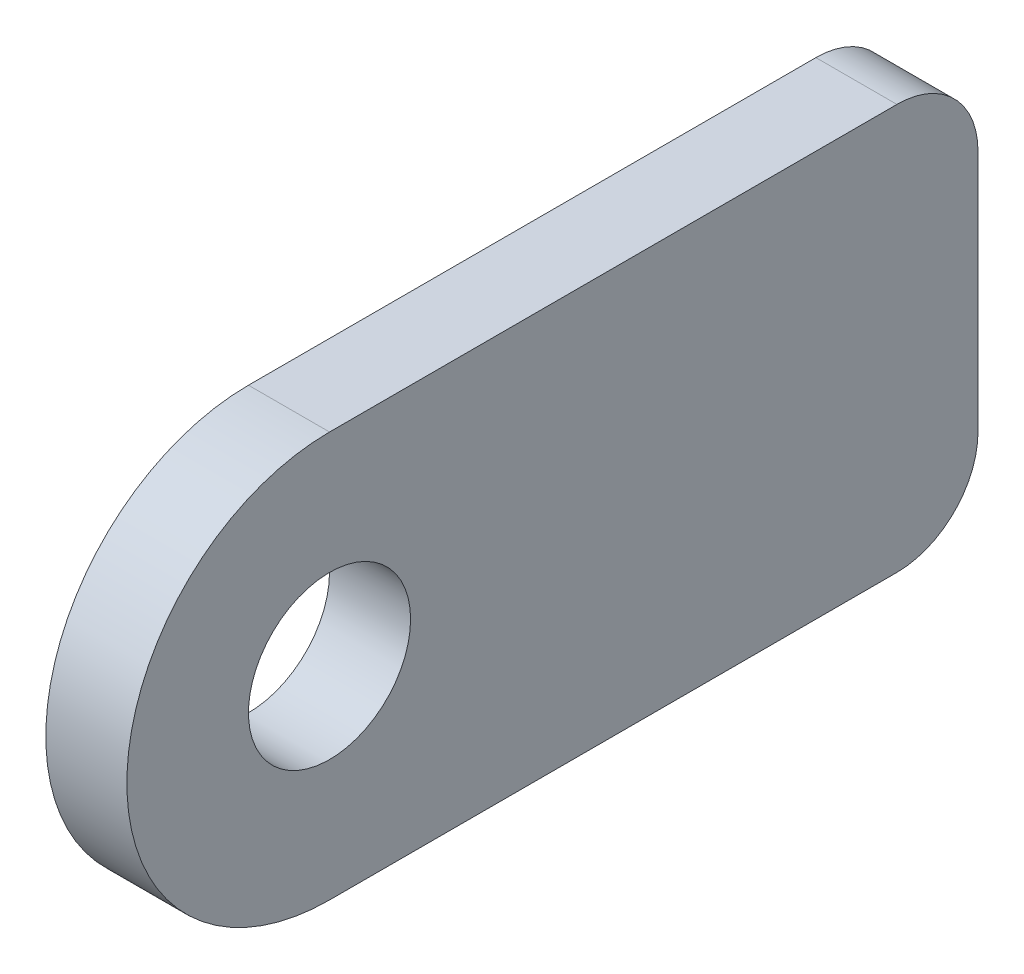
ISO-10303-21;
HEADER;
FILE_DESCRIPTION(('STEP AP214'),'2;1');
FILE_NAME('part.step','',(''),(''),'','','');
FILE_SCHEMA(('AUTOMOTIVE_DESIGN { 1 0 10303 214 1 1 1 1 }'));
ENDSEC;
DATA;
#1=APPLICATION_CONTEXT('core data for automotive mechanical design processes');
#2=APPLICATION_PROTOCOL_DEFINITION('international standard','automotive_design',2000,#1);
#3=PRODUCT_CONTEXT('',#1,'mechanical');
#4=PRODUCT('Part','Part','',(#3));
#5=PRODUCT_RELATED_PRODUCT_CATEGORY('part','',(#4));
#6=PRODUCT_DEFINITION_FORMATION('','',#4);
#7=PRODUCT_DEFINITION_CONTEXT('part definition',#1,'design');
#8=PRODUCT_DEFINITION('design','',#6,#7);
#9=PRODUCT_DEFINITION_SHAPE('','',#8);
#10=(LENGTH_UNIT() NAMED_UNIT(*) SI_UNIT(.MILLI.,.METRE.));
#11=(NAMED_UNIT(*) PLANE_ANGLE_UNIT() SI_UNIT($,.RADIAN.));
#12=(NAMED_UNIT(*) SI_UNIT($,.STERADIAN.) SOLID_ANGLE_UNIT());
#13=UNCERTAINTY_MEASURE_WITH_UNIT(LENGTH_MEASURE(1.E-05),#10,'distance_accuracy_value','');
#14=(GEOMETRIC_REPRESENTATION_CONTEXT(3) GLOBAL_UNCERTAINTY_ASSIGNED_CONTEXT((#13)) GLOBAL_UNIT_ASSIGNED_CONTEXT((#10,
#11,#12)) REPRESENTATION_CONTEXT('',''));
#15=CARTESIAN_POINT('',(0.,0.,0.));
#16=DIRECTION('',(0.,0.,1.));
#17=DIRECTION('',(1.,0.,0.));
#18=AXIS2_PLACEMENT_3D('',#15,#16,#17);
#19=CARTESIAN_POINT('',(10.,-25.,-20.));
#20=DIRECTION('',(1.,0.,0.));
#21=DIRECTION('',(0.,0.,-1.));
#22=AXIS2_PLACEMENT_3D('',#19,#20,#21);
#23=PLANE('',#22);
#24=DIRECTION('',(0.,1.,0.));
#25=VECTOR('',#24,1.);
#26=CARTESIAN_POINT('',(10.,0.,-100.));
#27=LINE('',#26,#25);
#28=CARTESIAN_POINT('',(10.,-40.,-100.));
#29=VERTEX_POINT('',#28);
#30=CARTESIAN_POINT('',(10.,-10.,-100.));
#31=VERTEX_POINT('',#30);
#32=EDGE_CURVE('E103',#29,#31,#27,.T.);
#33=ORIENTED_EDGE('',*,*,#32,.T.);
#34=CARTESIAN_POINT('',(10.,-10.,-90.));
#35=DIRECTION('',(1.,0.,0.));
#36=DIRECTION('',(0.,0.,-1.));
#37=AXIS2_PLACEMENT_3D('',#34,#35,#36);
#38=CIRCLE('',#37,10.);
#39=CARTESIAN_POINT('',(10.,0.,-90.));
#40=VERTEX_POINT('',#39);
#41=EDGE_CURVE('E50',#31,#40,#38,.T.);
#42=ORIENTED_EDGE('',*,*,#41,.T.);
#43=DIRECTION('',(0.,0.,1.));
#44=VECTOR('',#43,1.);
#45=CARTESIAN_POINT('',(10.,0.,-20.));
#46=LINE('',#45,#44);
#47=CARTESIAN_POINT('',(10.,0.,-20.));
#48=VERTEX_POINT('',#47);
#49=EDGE_CURVE('E91',#40,#48,#46,.T.);
#50=ORIENTED_EDGE('',*,*,#49,.T.);
#51=CARTESIAN_POINT('',(10.,-25.,-20.));
#52=DIRECTION('',(1.,0.,0.));
#53=DIRECTION('',(0.,0.,-1.));
#54=AXIS2_PLACEMENT_3D('',#51,#52,#53);
#55=CIRCLE('',#54,25.);
#56=CARTESIAN_POINT('',(10.,-50.,-20.));
#57=VERTEX_POINT('',#56);
#58=EDGE_CURVE('E100',#48,#57,#55,.T.);
#59=ORIENTED_EDGE('',*,*,#58,.T.);
#60=DIRECTION('',(0.,0.,-1.));
#61=VECTOR('',#60,1.);
#62=CARTESIAN_POINT('',(10.,-50.,-20.));
#63=LINE('',#62,#61);
#64=CARTESIAN_POINT('',(10.,-50.,-90.));
#65=VERTEX_POINT('',#64);
#66=EDGE_CURVE('E120',#57,#65,#63,.T.);
#67=ORIENTED_EDGE('',*,*,#66,.T.);
#68=CARTESIAN_POINT('',(10.,-40.,-90.));
#69=DIRECTION('',(1.,0.,0.));
#70=DIRECTION('',(0.,0.,-1.));
#71=AXIS2_PLACEMENT_3D('',#68,#69,#70);
#72=CIRCLE('',#71,10.);
#73=EDGE_CURVE('E138',#65,#29,#72,.T.);
#74=ORIENTED_EDGE('',*,*,#73,.T.);
#75=EDGE_LOOP('',(#33,#42,#50,#59,#67,#74));
#76=FACE_BOUND('',#75,.T.);
#77=CARTESIAN_POINT('',(10.,-25.,-20.));
#78=DIRECTION('',(1.,0.,0.));
#79=DIRECTION('',(0.,0.,-1.));
#80=AXIS2_PLACEMENT_3D('',#77,#78,#79);
#81=CIRCLE('',#80,10.);
#82=CARTESIAN_POINT('',(10.,-25.,-30.));
#83=VERTEX_POINT('',#82);
#84=EDGE_CURVE('E121',#83,#83,#81,.T.);
#85=ORIENTED_EDGE('',*,*,#84,.F.);
#86=EDGE_LOOP('',(#85));
#87=FACE_BOUND('',#86,.T.);
#88=ADVANCED_FACE('F39',(#76,#87),#23,.T.);
#89=CARTESIAN_POINT('',(0.,-25.,-20.));
#90=DIRECTION('',(1.,0.,0.));
#91=DIRECTION('',(0.,0.,-1.));
#92=AXIS2_PLACEMENT_3D('',#89,#90,#91);
#93=PLANE('',#92);
#94=DIRECTION('',(0.,0.,1.));
#95=VECTOR('',#94,1.);
#96=CARTESIAN_POINT('',(0.,0.,-20.));
#97=LINE('',#96,#95);
#98=CARTESIAN_POINT('',(0.,0.,-90.));
#99=VERTEX_POINT('',#98);
#100=CARTESIAN_POINT('',(0.,0.,-20.));
#101=VERTEX_POINT('',#100);
#102=EDGE_CURVE('E108',#99,#101,#97,.T.);
#103=ORIENTED_EDGE('',*,*,#102,.F.);
#104=CARTESIAN_POINT('',(0.,-10.,-90.));
#105=DIRECTION('',(1.,0.,0.));
#106=DIRECTION('',(0.,0.,-1.));
#107=AXIS2_PLACEMENT_3D('',#104,#105,#106);
#108=CIRCLE('',#107,10.);
#109=CARTESIAN_POINT('',(0.,-10.,-100.));
#110=VERTEX_POINT('',#109);
#111=EDGE_CURVE('E131',#99,#110,#108,.F.);
#112=ORIENTED_EDGE('',*,*,#111,.T.);
#113=DIRECTION('',(0.,1.,0.));
#114=VECTOR('',#113,1.);
#115=CARTESIAN_POINT('',(0.,0.,-100.));
#116=LINE('',#115,#114);
#117=CARTESIAN_POINT('',(0.,-40.,-100.));
#118=VERTEX_POINT('',#117);
#119=EDGE_CURVE('E124',#118,#110,#116,.T.);
#120=ORIENTED_EDGE('',*,*,#119,.F.);
#121=CARTESIAN_POINT('',(0.,-40.,-90.));
#122=DIRECTION('',(1.,0.,0.));
#123=DIRECTION('',(0.,0.,-1.));
#124=AXIS2_PLACEMENT_3D('',#121,#122,#123);
#125=CIRCLE('',#124,10.);
#126=CARTESIAN_POINT('',(0.,-50.,-90.));
#127=VERTEX_POINT('',#126);
#128=EDGE_CURVE('E135',#118,#127,#125,.F.);
#129=ORIENTED_EDGE('',*,*,#128,.T.);
#130=DIRECTION('',(0.,0.,-1.));
#131=VECTOR('',#130,1.);
#132=CARTESIAN_POINT('',(0.,-50.,-20.));
#133=LINE('',#132,#131);
#134=CARTESIAN_POINT('',(0.,-50.,-20.));
#135=VERTEX_POINT('',#134);
#136=EDGE_CURVE('E126',#135,#127,#133,.T.);
#137=ORIENTED_EDGE('',*,*,#136,.F.);
#138=CARTESIAN_POINT('',(0.,-25.,-20.));
#139=DIRECTION('',(1.,0.,0.));
#140=DIRECTION('',(0.,0.,-1.));
#141=AXIS2_PLACEMENT_3D('',#138,#139,#140);
#142=CIRCLE('',#141,25.);
#143=EDGE_CURVE('E127',#101,#135,#142,.T.);
#144=ORIENTED_EDGE('',*,*,#143,.F.);
#145=EDGE_LOOP('',(#103,#112,#120,#129,#137,#144));
#146=FACE_BOUND('',#145,.T.);
#147=CARTESIAN_POINT('',(0.,-25.,-20.));
#148=DIRECTION('',(1.,0.,0.));
#149=DIRECTION('',(0.,0.,-1.));
#150=AXIS2_PLACEMENT_3D('',#147,#148,#149);
#151=CIRCLE('',#150,10.);
#152=CARTESIAN_POINT('',(0.,-25.,-30.));
#153=VERTEX_POINT('',#152);
#154=EDGE_CURVE('E228',#153,#153,#151,.T.);
#155=ORIENTED_EDGE('',*,*,#154,.T.);
#156=EDGE_LOOP('',(#155));
#157=FACE_BOUND('',#156,.T.);
#158=ADVANCED_FACE('F146',(#146,#157),#93,.F.);
#159=CARTESIAN_POINT('',(10.,0.,-100.));
#160=DIRECTION('',(0.,0.,1.));
#161=DIRECTION('',(0.,-1.,0.));
#162=AXIS2_PLACEMENT_3D('',#159,#160,#161);
#163=PLANE('',#162);
#164=ORIENTED_EDGE('',*,*,#119,.T.);
#165=DIRECTION('',(-1.,0.,0.));
#166=VECTOR('',#165,1.);
#167=CARTESIAN_POINT('',(10.,-10.,-100.));
#168=LINE('',#167,#166);
#169=EDGE_CURVE('E58',#110,#31,#168,.F.);
#170=ORIENTED_EDGE('',*,*,#169,.T.);
#171=ORIENTED_EDGE('',*,*,#32,.F.);
#172=DIRECTION('',(-1.,0.,0.));
#173=VECTOR('',#172,1.);
#174=CARTESIAN_POINT('',(10.,-40.,-100.));
#175=LINE('',#174,#173);
#176=EDGE_CURVE('E137',#29,#118,#175,.T.);
#177=ORIENTED_EDGE('',*,*,#176,.T.);
#178=EDGE_LOOP('',(#164,#170,#171,#177));
#179=FACE_BOUND('',#178,.T.);
#180=ADVANCED_FACE('F145',(#179),#163,.F.);
#181=CARTESIAN_POINT('',(10.,0.,-20.));
#182=DIRECTION('',(0.,-1.,0.));
#183=DIRECTION('',(0.,0.,-1.));
#184=AXIS2_PLACEMENT_3D('',#181,#182,#183);
#185=PLANE('',#184);
#186=ORIENTED_EDGE('',*,*,#49,.F.);
#187=DIRECTION('',(-1.,0.,0.));
#188=VECTOR('',#187,1.);
#189=CARTESIAN_POINT('',(10.,0.,-90.));
#190=LINE('',#189,#188);
#191=EDGE_CURVE('E115',#40,#99,#190,.T.);
#192=ORIENTED_EDGE('',*,*,#191,.T.);
#193=ORIENTED_EDGE('',*,*,#102,.T.);
#194=DIRECTION('',(-1.,0.,0.));
#195=VECTOR('',#194,1.);
#196=CARTESIAN_POINT('',(10.,0.,-20.));
#197=LINE('',#196,#195);
#198=EDGE_CURVE('E106',#48,#101,#197,.T.);
#199=ORIENTED_EDGE('',*,*,#198,.F.);
#200=EDGE_LOOP('',(#186,#192,#193,#199));
#201=FACE_BOUND('',#200,.T.);
#202=ADVANCED_FACE('F110',(#201),#185,.F.);
#203=CARTESIAN_POINT('',(10.,-25.,-20.));
#204=DIRECTION('',(-1.,0.,0.));
#205=DIRECTION('',(0.,0.,1.));
#206=AXIS2_PLACEMENT_3D('',#203,#204,#205);
#207=CYLINDRICAL_SURFACE('',#206,25.);
#208=ORIENTED_EDGE('',*,*,#143,.T.);
#209=DIRECTION('',(-1.,0.,0.));
#210=VECTOR('',#209,1.);
#211=CARTESIAN_POINT('',(10.,-50.,-20.));
#212=LINE('',#211,#210);
#213=EDGE_CURVE('E114',#57,#135,#212,.T.);
#214=ORIENTED_EDGE('',*,*,#213,.F.);
#215=ORIENTED_EDGE('',*,*,#58,.F.);
#216=ORIENTED_EDGE('',*,*,#198,.T.);
#217=EDGE_LOOP('',(#208,#214,#215,#216));
#218=FACE_BOUND('',#217,.T.);
#219=ADVANCED_FACE('F113',(#218),#207,.T.);
#220=CARTESIAN_POINT('',(10.,-50.,-20.));
#221=DIRECTION('',(0.,1.,0.));
#222=DIRECTION('',(0.,0.,1.));
#223=AXIS2_PLACEMENT_3D('',#220,#221,#222);
#224=PLANE('',#223);
#225=ORIENTED_EDGE('',*,*,#136,.T.);
#226=DIRECTION('',(-1.,0.,0.));
#227=VECTOR('',#226,1.);
#228=CARTESIAN_POINT('',(10.,-50.,-90.));
#229=LINE('',#228,#227);
#230=EDGE_CURVE('E11',#127,#65,#229,.F.);
#231=ORIENTED_EDGE('',*,*,#230,.T.);
#232=ORIENTED_EDGE('',*,*,#66,.F.);
#233=ORIENTED_EDGE('',*,*,#213,.T.);
#234=EDGE_LOOP('',(#225,#231,#232,#233));
#235=FACE_BOUND('',#234,.T.);
#236=ADVANCED_FACE('F147',(#235),#224,.F.);
#237=CARTESIAN_POINT('',(10.,-25.,-20.));
#238=DIRECTION('',(-1.,0.,0.));
#239=DIRECTION('',(0.,0.,1.));
#240=AXIS2_PLACEMENT_3D('',#237,#238,#239);
#241=CYLINDRICAL_SURFACE('',#240,10.);
#242=ORIENTED_EDGE('',*,*,#84,.T.);
#243=EDGE_LOOP('',(#242));
#244=FACE_BOUND('',#243,.T.);
#245=ORIENTED_EDGE('',*,*,#154,.F.);
#246=EDGE_LOOP('',(#245));
#247=FACE_BOUND('',#246,.T.);
#248=ADVANCED_FACE('F155',(#244,#247),#241,.F.);
#249=CARTESIAN_POINT('',(10.,-10.,-90.));
#250=DIRECTION('',(-1.,0.,0.));
#251=DIRECTION('',(0.,0.,1.));
#252=AXIS2_PLACEMENT_3D('',#249,#250,#251);
#253=CYLINDRICAL_SURFACE('',#252,10.);
#254=ORIENTED_EDGE('',*,*,#41,.F.);
#255=ORIENTED_EDGE('',*,*,#169,.F.);
#256=ORIENTED_EDGE('',*,*,#111,.F.);
#257=ORIENTED_EDGE('',*,*,#191,.F.);
#258=EDGE_LOOP('',(#254,#255,#256,#257));
#259=FACE_BOUND('',#258,.T.);
#260=ADVANCED_FACE('F157',(#259),#253,.T.);
#261=CARTESIAN_POINT('',(10.,-40.,-90.));
#262=DIRECTION('',(-1.,0.,0.));
#263=DIRECTION('',(0.,0.,1.));
#264=AXIS2_PLACEMENT_3D('',#261,#262,#263);
#265=CYLINDRICAL_SURFACE('',#264,10.);
#266=ORIENTED_EDGE('',*,*,#73,.F.);
#267=ORIENTED_EDGE('',*,*,#230,.F.);
#268=ORIENTED_EDGE('',*,*,#128,.F.);
#269=ORIENTED_EDGE('',*,*,#176,.F.);
#270=EDGE_LOOP('',(#266,#267,#268,#269));
#271=FACE_BOUND('',#270,.T.);
#272=ADVANCED_FACE('F41',(#271),#265,.T.);
#273=CLOSED_SHELL('',(#88,#158,#180,#202,#219,#236,#248,#260,#272));
#274=MANIFOLD_SOLID_BREP('B2',#273);
#275=ADVANCED_BREP_SHAPE_REPRESENTATION('',(#18,#274),#14);
#276=SHAPE_DEFINITION_REPRESENTATION(#9,#275);
ENDSEC;
END-ISO-10303-21;
